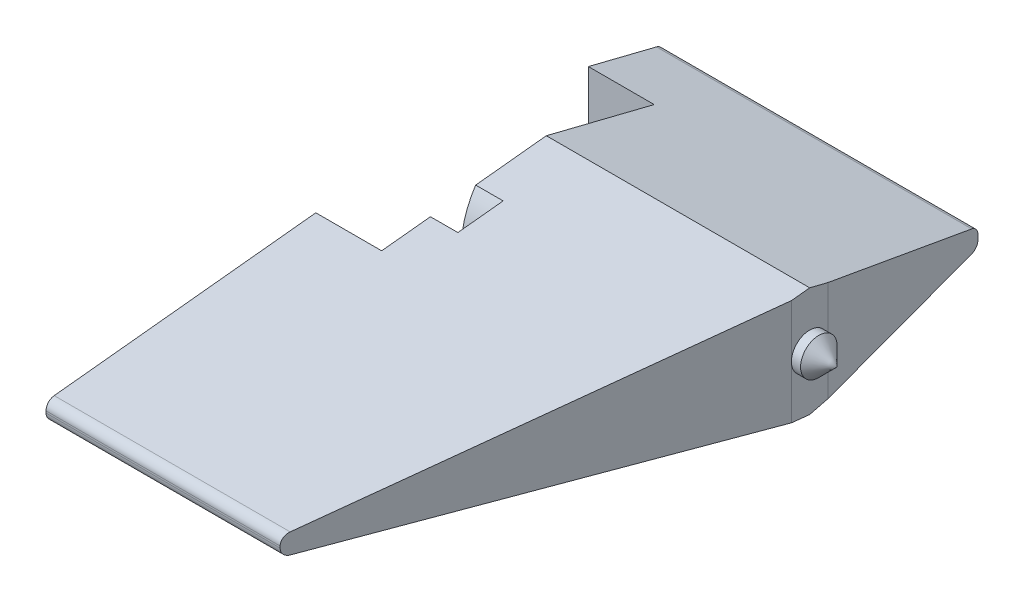
ISO-10303-21;
HEADER;
FILE_DESCRIPTION(('STEP AP214'),'2;1');
FILE_NAME('part.step','',(''),(''),'','','');
FILE_SCHEMA(('AUTOMOTIVE_DESIGN { 1 0 10303 214 1 1 1 1 }'));
ENDSEC;
DATA;
#1=APPLICATION_CONTEXT('core data for automotive mechanical design processes');
#2=APPLICATION_PROTOCOL_DEFINITION('international standard','automotive_design',2000,#1);
#3=PRODUCT_CONTEXT('',#1,'mechanical');
#4=PRODUCT('Part','Part','',(#3));
#5=PRODUCT_RELATED_PRODUCT_CATEGORY('part','',(#4));
#6=PRODUCT_DEFINITION_FORMATION('','',#4);
#7=PRODUCT_DEFINITION_CONTEXT('part definition',#1,'design');
#8=PRODUCT_DEFINITION('design','',#6,#7);
#9=PRODUCT_DEFINITION_SHAPE('','',#8);
#10=(LENGTH_UNIT() NAMED_UNIT(*) SI_UNIT(.MILLI.,.METRE.));
#11=(NAMED_UNIT(*) PLANE_ANGLE_UNIT() SI_UNIT($,.RADIAN.));
#12=(NAMED_UNIT(*) SI_UNIT($,.STERADIAN.) SOLID_ANGLE_UNIT());
#13=UNCERTAINTY_MEASURE_WITH_UNIT(LENGTH_MEASURE(1.E-05),#10,'distance_accuracy_value','');
#14=(GEOMETRIC_REPRESENTATION_CONTEXT(3) GLOBAL_UNCERTAINTY_ASSIGNED_CONTEXT((#13)) GLOBAL_UNIT_ASSIGNED_CONTEXT((#10,
#11,#12)) REPRESENTATION_CONTEXT('',''));
#15=CARTESIAN_POINT('',(0.,0.,0.));
#16=DIRECTION('',(0.,0.,1.));
#17=DIRECTION('',(1.,0.,0.));
#18=AXIS2_PLACEMENT_3D('',#15,#16,#17);
#19=CARTESIAN_POINT('',(18.,0.,0.));
#20=DIRECTION('',(-1.,0.,0.));
#21=DIRECTION('',(0.,0.,1.));
#22=AXIS2_PLACEMENT_3D('',#19,#20,#21);
#23=PLANE('',#22);
#24=DIRECTION('',(0.,0.104684784518043,-0.994505452921406));
#25=VECTOR('',#24,1.);
#26=CARTESIAN_POINT('',(18.,0.499999999999997,23.75));
#27=LINE('',#26,#25);
#28=CARTESIAN_POINT('',(18.,2.89473684210526,1.));
#29=VERTEX_POINT('',#28);
#30=CARTESIAN_POINT('',(18.,3.,0.));
#31=VERTEX_POINT('',#30);
#32=EDGE_CURVE('E348',#29,#31,#27,.T.);
#33=ORIENTED_EDGE('',*,*,#32,.F.);
#34=DIRECTION('',(0.,1.,0.));
#35=VECTOR('',#34,1.);
#36=CARTESIAN_POINT('',(18.,-3.0001,1.));
#37=LINE('',#36,#35);
#38=CARTESIAN_POINT('',(18.,0.,1.));
#39=VERTEX_POINT('',#38);
#40=EDGE_CURVE('E224',#39,#29,#37,.T.);
#41=ORIENTED_EDGE('',*,*,#40,.F.);
#42=CARTESIAN_POINT('',(18.,0.,0.));
#43=DIRECTION('',(-1.,0.,0.));
#44=DIRECTION('',(0.,0.,1.));
#45=AXIS2_PLACEMENT_3D('',#42,#43,#44);
#46=CIRCLE('',#45,1.);
#47=CARTESIAN_POINT('',(18.,0.,-1.));
#48=VERTEX_POINT('',#47);
#49=EDGE_CURVE('E444',#48,#39,#46,.F.);
#50=ORIENTED_EDGE('',*,*,#49,.F.);
#51=DIRECTION('',(0.,1.,0.));
#52=VECTOR('',#51,1.);
#53=CARTESIAN_POINT('',(18.,-3.0001,-1.));
#54=LINE('',#53,#52);
#55=CARTESIAN_POINT('',(18.,2.75,-1.));
#56=VERTEX_POINT('',#55);
#57=EDGE_CURVE('E506',#48,#56,#54,.T.);
#58=ORIENTED_EDGE('',*,*,#57,.T.);
#59=DIRECTION('',(0.,-0.242535625036333,-0.970142500145332));
#60=VECTOR('',#59,1.);
#61=CARTESIAN_POINT('',(18.,3.,0.));
#62=LINE('',#61,#60);
#63=EDGE_CURVE('E438',#31,#56,#62,.T.);
#64=ORIENTED_EDGE('',*,*,#63,.F.);
#65=EDGE_LOOP('',(#33,#41,#50,#58,#64));
#66=FACE_BOUND('',#65,.T.);
#67=ADVANCED_FACE('F48',(#66),#23,.F.);
#68=EDGE_CURVE('E222',#39,#48,#46,.F.);
#69=ORIENTED_EDGE('',*,*,#68,.F.);
#70=CARTESIAN_POINT('',(18.,-2.89473684210526,1.));
#71=VERTEX_POINT('',#70);
#72=EDGE_CURVE('E204',#71,#39,#37,.T.);
#73=ORIENTED_EDGE('',*,*,#72,.F.);
#74=DIRECTION('',(0.,-0.104684784518043,-0.994505452921406));
#75=VECTOR('',#74,1.);
#76=CARTESIAN_POINT('',(18.,-0.500000000000003,23.75));
#77=LINE('',#76,#75);
#78=CARTESIAN_POINT('',(18.,-3.,0.));
#79=VERTEX_POINT('',#78);
#80=EDGE_CURVE('E218',#71,#79,#77,.T.);
#81=ORIENTED_EDGE('',*,*,#80,.T.);
#82=DIRECTION('',(0.,0.242535625036333,-0.970142500145332));
#83=VECTOR('',#82,1.);
#84=CARTESIAN_POINT('',(18.,-3.,0.));
#85=LINE('',#84,#83);
#86=CARTESIAN_POINT('',(18.,-2.75,-1.));
#87=VERTEX_POINT('',#86);
#88=EDGE_CURVE('E232',#79,#87,#85,.T.);
#89=ORIENTED_EDGE('',*,*,#88,.T.);
#90=EDGE_CURVE('E501',#87,#48,#54,.T.);
#91=ORIENTED_EDGE('',*,*,#90,.T.);
#92=EDGE_LOOP('',(#69,#73,#81,#89,#91));
#93=FACE_BOUND('',#92,.T.);
#94=ADVANCED_FACE('F216',(#93),#23,.F.);
#95=CARTESIAN_POINT('',(0.,-2.96712328767123,0.312328767123287));
#96=DIRECTION('',(0.,0.994505452921406,-0.104684784518043));
#97=DIRECTION('',(0.,0.104684784518043,0.994505452921406));
#98=AXIS2_PLACEMENT_3D('',#95,#96,#97);
#99=PLANE('',#98);
#100=DIRECTION('',(-0.221660793310699,0.102080628498348,0.969765970734308));
#101=VECTOR('',#100,1.);
#102=CARTESIAN_POINT('',(17.2650559620951,-2.55627577201747,4.21538016583409));
#103=LINE('',#102,#101);
#104=CARTESIAN_POINT('',(12.9023217389122,-0.547121853446422,23.302342392259));
#105=VERTEX_POINT('',#104);
#106=EDGE_CURVE('E200',#71,#105,#103,.T.);
#107=ORIENTED_EDGE('',*,*,#106,.T.);
#108=DIRECTION('',(1.,0.,0.));
#109=VECTOR('',#108,1.);
#110=CARTESIAN_POINT('',(0.,-0.547121853446422,23.302342392259));
#111=LINE('',#110,#109);
#112=CARTESIAN_POINT('',(0.,-0.547121853446422,23.302342392259));
#113=VERTEX_POINT('',#112);
#114=EDGE_CURVE('E490',#105,#113,#111,.F.);
#115=ORIENTED_EDGE('',*,*,#114,.T.);
#116=DIRECTION('',(0.,-0.104684784518043,-0.994505452921406));
#117=VECTOR('',#116,1.);
#118=CARTESIAN_POINT('',(0.,-0.500000000000003,23.75));
#119=LINE('',#118,#117);
#120=CARTESIAN_POINT('',(0.,-2.05263157894737,9.));
#121=VERTEX_POINT('',#120);
#122=EDGE_CURVE('E285',#113,#121,#119,.T.);
#123=ORIENTED_EDGE('',*,*,#122,.T.);
#124=DIRECTION('',(1.,0.,0.));
#125=VECTOR('',#124,1.);
#126=CARTESIAN_POINT('',(0.,-2.05263157894737,9.));
#127=LINE('',#126,#125);
#128=CARTESIAN_POINT('',(3.6,-2.05263157894737,9.));
#129=VERTEX_POINT('',#128);
#130=EDGE_CURVE('E540',#121,#129,#127,.T.);
#131=ORIENTED_EDGE('',*,*,#130,.T.);
#132=DIRECTION('',(0.,-0.104684784518043,-0.994505452921406));
#133=VECTOR('',#132,1.);
#134=CARTESIAN_POINT('',(3.6,-2.96712328767123,0.312328767123287));
#135=LINE('',#134,#133);
#136=CARTESIAN_POINT('',(3.6,-2.33327329775217,6.3339036713544));
#137=VERTEX_POINT('',#136);
#138=EDGE_CURVE('E826',#129,#137,#135,.T.);
#139=ORIENTED_EDGE('',*,*,#138,.T.);
#140=DIRECTION('',(1.,0.,0.));
#141=VECTOR('',#140,1.);
#142=CARTESIAN_POINT('',(6.5,-2.33327329775217,6.3339036713544));
#143=LINE('',#142,#141);
#144=CARTESIAN_POINT('',(5.1,-2.33327329775217,6.3339036713544));
#145=VERTEX_POINT('',#144);
#146=EDGE_CURVE('E520',#145,#137,#143,.F.);
#147=ORIENTED_EDGE('',*,*,#146,.F.);
#148=DIRECTION('',(0.,0.104684784518043,0.994505452921406));
#149=VECTOR('',#148,1.);
#150=CARTESIAN_POINT('',(5.1,-2.96712328767123,0.312328767123287));
#151=LINE('',#150,#149);
#152=CARTESIAN_POINT('',(5.1,-2.59374727701062,3.85940086839914));
#153=VERTEX_POINT('',#152);
#154=EDGE_CURVE('E527',#153,#145,#151,.T.);
#155=ORIENTED_EDGE('',*,*,#154,.F.);
#156=DIRECTION('',(1.,0.,0.));
#157=VECTOR('',#156,1.);
#158=CARTESIAN_POINT('',(6.5,-2.59374727701062,3.85940086839914));
#159=LINE('',#158,#157);
#160=CARTESIAN_POINT('',(3.6,-2.59374727701062,3.85940086839914));
#161=VERTEX_POINT('',#160);
#162=EDGE_CURVE('E525',#161,#153,#159,.T.);
#163=ORIENTED_EDGE('',*,*,#162,.F.);
#164=CARTESIAN_POINT('',(3.6,-3.,0.));
#165=VERTEX_POINT('',#164);
#166=EDGE_CURVE('E825',#161,#165,#135,.T.);
#167=ORIENTED_EDGE('',*,*,#166,.T.);
#168=DIRECTION('',(1.,0.,0.));
#169=VECTOR('',#168,1.);
#170=CARTESIAN_POINT('',(0.,-3.,0.));
#171=LINE('',#170,#169);
#172=EDGE_CURVE('E229',#165,#79,#171,.T.);
#173=ORIENTED_EDGE('',*,*,#172,.T.);
#174=ORIENTED_EDGE('',*,*,#80,.F.);
#175=EDGE_LOOP('',(#107,#115,#123,#131,#139,#147,#155,#163,#167,#173,#174));
#176=FACE_BOUND('',#175,.T.);
#177=ADVANCED_FACE('F227',(#176),#99,.F.);
#178=CARTESIAN_POINT('',(0.,2.96712328767123,0.312328767123288));
#179=DIRECTION('',(0.,0.994505452921406,0.104684784518043));
#180=DIRECTION('',(0.,-0.104684784518043,0.994505452921406));
#181=AXIS2_PLACEMENT_3D('',#178,#179,#180);
#182=PLANE('',#181);
#183=DIRECTION('',(0.,0.104684784518043,-0.994505452921406));
#184=VECTOR('',#183,1.);
#185=CARTESIAN_POINT('',(0.,0.499999999999997,23.75));
#186=LINE('',#185,#184);
#187=CARTESIAN_POINT('',(0.,0.547121853446417,23.302342392259));
#188=VERTEX_POINT('',#187);
#189=CARTESIAN_POINT('',(0.,2.05263157894737,9.00000000000001));
#190=VERTEX_POINT('',#189);
#191=EDGE_CURVE('E346',#188,#190,#186,.T.);
#192=ORIENTED_EDGE('',*,*,#191,.F.);
#193=DIRECTION('',(1.,0.,0.));
#194=VECTOR('',#193,1.);
#195=CARTESIAN_POINT('',(0.,0.547121853446417,23.302342392259));
#196=LINE('',#195,#194);
#197=CARTESIAN_POINT('',(12.9023217389122,0.547121853446417,23.302342392259));
#198=VERTEX_POINT('',#197);
#199=EDGE_CURVE('E355',#188,#198,#196,.T.);
#200=ORIENTED_EDGE('',*,*,#199,.T.);
#201=DIRECTION('',(-0.221660793310699,-0.102080628498348,0.969765970734308));
#202=VECTOR('',#201,1.);
#203=CARTESIAN_POINT('',(17.2650559620951,2.55627577201746,4.21538016583409));
#204=LINE('',#203,#202);
#205=EDGE_CURVE('E212',#29,#198,#204,.T.);
#206=ORIENTED_EDGE('',*,*,#205,.F.);
#207=ORIENTED_EDGE('',*,*,#32,.T.);
#208=DIRECTION('',(1.,0.,0.));
#209=VECTOR('',#208,1.);
#210=CARTESIAN_POINT('',(0.,3.,0.));
#211=LINE('',#210,#209);
#212=CARTESIAN_POINT('',(3.6,3.,0.));
#213=VERTEX_POINT('',#212);
#214=EDGE_CURVE('E231',#213,#31,#211,.T.);
#215=ORIENTED_EDGE('',*,*,#214,.F.);
#216=DIRECTION('',(0.,0.104684784518043,-0.994505452921406));
#217=VECTOR('',#216,1.);
#218=CARTESIAN_POINT('',(3.6,2.96712328767123,0.312328767123288));
#219=LINE('',#218,#217);
#220=CARTESIAN_POINT('',(3.6,2.59374727701062,3.85940086839914));
#221=VERTEX_POINT('',#220);
#222=EDGE_CURVE('E823',#221,#213,#219,.T.);
#223=ORIENTED_EDGE('',*,*,#222,.F.);
#224=DIRECTION('',(1.,0.,0.));
#225=VECTOR('',#224,1.);
#226=CARTESIAN_POINT('',(6.5,2.59374727701062,3.85940086839914));
#227=LINE('',#226,#225);
#228=CARTESIAN_POINT('',(5.1,2.59374727701062,3.85940086839914));
#229=VERTEX_POINT('',#228);
#230=EDGE_CURVE('E522',#221,#229,#227,.T.);
#231=ORIENTED_EDGE('',*,*,#230,.T.);
#232=DIRECTION('',(0.,-0.104684784518043,0.994505452921406));
#233=VECTOR('',#232,1.);
#234=CARTESIAN_POINT('',(5.1,2.96712328767123,0.312328767123288));
#235=LINE('',#234,#233);
#236=CARTESIAN_POINT('',(5.1,2.33327329775217,6.3339036713544));
#237=VERTEX_POINT('',#236);
#238=EDGE_CURVE('E446',#229,#237,#235,.T.);
#239=ORIENTED_EDGE('',*,*,#238,.T.);
#240=DIRECTION('',(1.,0.,0.));
#241=VECTOR('',#240,1.);
#242=CARTESIAN_POINT('',(6.5,2.33327329775217,6.3339036713544));
#243=LINE('',#242,#241);
#244=CARTESIAN_POINT('',(3.6,2.33327329775217,6.3339036713544));
#245=VERTEX_POINT('',#244);
#246=EDGE_CURVE('E517',#237,#245,#243,.F.);
#247=ORIENTED_EDGE('',*,*,#246,.T.);
#248=CARTESIAN_POINT('',(3.6,2.05263157894737,9.));
#249=VERTEX_POINT('',#248);
#250=EDGE_CURVE('E821',#249,#245,#219,.T.);
#251=ORIENTED_EDGE('',*,*,#250,.F.);
#252=DIRECTION('',(1.,0.,0.));
#253=VECTOR('',#252,1.);
#254=CARTESIAN_POINT('',(0.,2.05263157894737,9.));
#255=LINE('',#254,#253);
#256=EDGE_CURVE('E776',#190,#249,#255,.T.);
#257=ORIENTED_EDGE('',*,*,#256,.F.);
#258=EDGE_LOOP('',(#192,#200,#206,#207,#215,#223,#231,#239,#247,#251,#257));
#259=FACE_BOUND('',#258,.T.);
#260=ADVANCED_FACE('F258',(#259),#182,.T.);
#261=CARTESIAN_POINT('',(3.6,-3.0001,-5.9));
#262=DIRECTION('',(1.,0.,0.));
#263=DIRECTION('',(0.,0.,-1.));
#264=AXIS2_PLACEMENT_3D('',#261,#262,#263);
#265=PLANE('',#264);
#266=CARTESIAN_POINT('',(3.6,0.,0.));
#267=DIRECTION('',(1.,0.,0.));
#268=DIRECTION('',(0.,0.,-1.));
#269=AXIS2_PLACEMENT_3D('',#266,#267,#268);
#270=CIRCLE('',#269,1.95);
#271=CARTESIAN_POINT('',(3.6,0.,1.95));
#272=VERTEX_POINT('',#271);
#273=EDGE_CURVE('E406',#272,#272,#270,.T.);
#274=ORIENTED_EDGE('',*,*,#273,.T.);
#275=EDGE_LOOP('',(#274));
#276=FACE_BOUND('',#275,.T.);
#277=CARTESIAN_POINT('',(3.6,0.,0.));
#278=DIRECTION('',(1.,0.,0.));
#279=DIRECTION('',(0.,0.,-1.));
#280=AXIS2_PLACEMENT_3D('',#277,#278,#279);
#281=CIRCLE('',#280,4.65);
#282=EDGE_CURVE('E449',#221,#161,#281,.T.);
#283=ORIENTED_EDGE('',*,*,#282,.F.);
#284=ORIENTED_EDGE('',*,*,#222,.T.);
#285=DIRECTION('',(0.,-0.242535625036333,-0.970142500145332));
#286=VECTOR('',#285,1.);
#287=CARTESIAN_POINT('',(3.6,2.82352941176471,-0.705882352941177));
#288=LINE('',#287,#286);
#289=CARTESIAN_POINT('',(3.6,1.525,-5.9));
#290=VERTEX_POINT('',#289);
#291=EDGE_CURVE('E802',#213,#290,#288,.T.);
#292=ORIENTED_EDGE('',*,*,#291,.T.);
#293=DIRECTION('',(0.,1.,0.));
#294=VECTOR('',#293,1.);
#295=CARTESIAN_POINT('',(3.6,-3.0001,-5.9));
#296=LINE('',#295,#294);
#297=CARTESIAN_POINT('',(3.6,-1.525,-5.9));
#298=VERTEX_POINT('',#297);
#299=EDGE_CURVE('E532',#298,#290,#296,.T.);
#300=ORIENTED_EDGE('',*,*,#299,.F.);
#301=DIRECTION('',(0.,0.242535625036333,-0.970142500145332));
#302=VECTOR('',#301,1.);
#303=CARTESIAN_POINT('',(3.6,-2.82352941176471,-0.705882352941178));
#304=LINE('',#303,#302);
#305=EDGE_CURVE('E543',#165,#298,#304,.T.);
#306=ORIENTED_EDGE('',*,*,#305,.F.);
#307=ORIENTED_EDGE('',*,*,#166,.F.);
#308=EDGE_LOOP('',(#283,#284,#292,#300,#306,#307));
#309=FACE_BOUND('',#308,.T.);
#310=ADVANCED_FACE('F370',(#276,#309),#265,.F.);
#311=CARTESIAN_POINT('',(3.6,0.,0.));
#312=DIRECTION('',(1.,0.,0.));
#313=DIRECTION('',(0.,0.,-1.));
#314=AXIS2_PLACEMENT_3D('',#311,#312,#313);
#315=CIRCLE('',#314,6.75);
#316=EDGE_CURVE('E451',#137,#245,#315,.F.);
#317=ORIENTED_EDGE('',*,*,#316,.F.);
#318=ORIENTED_EDGE('',*,*,#138,.F.);
#319=DIRECTION('',(0.,1.,0.));
#320=VECTOR('',#319,1.);
#321=CARTESIAN_POINT('',(3.6,-3.0001,9.));
#322=LINE('',#321,#320);
#323=EDGE_CURVE('E814',#129,#249,#322,.T.);
#324=ORIENTED_EDGE('',*,*,#323,.T.);
#325=ORIENTED_EDGE('',*,*,#250,.T.);
#326=EDGE_LOOP('',(#317,#318,#324,#325));
#327=FACE_BOUND('',#326,.T.);
#328=ADVANCED_FACE('F588',(#327),#265,.F.);
#329=CARTESIAN_POINT('',(0.,0.,0.));
#330=DIRECTION('',(-1.,0.,0.));
#331=DIRECTION('',(0.,0.,1.));
#332=AXIS2_PLACEMENT_3D('',#329,#330,#331);
#333=PLANE('',#332);
#334=DIRECTION('',(0.,-0.242535625036333,-0.970142500145332));
#335=VECTOR('',#334,1.);
#336=CARTESIAN_POINT('',(0.,3.,0.));
#337=LINE('',#336,#335);
#338=CARTESIAN_POINT('',(0.,1.525,-5.9));
#339=VERTEX_POINT('',#338);
#340=CARTESIAN_POINT('',(0.,0.594683046870458,-9.62126781251817));
#341=VERTEX_POINT('',#340);
#342=EDGE_CURVE('E773',#339,#341,#337,.T.);
#343=ORIENTED_EDGE('',*,*,#342,.T.);
#344=CARTESIAN_POINT('',(0.,0.109611796797793,-9.5));
#345=DIRECTION('',(-1.,0.,0.));
#346=DIRECTION('',(0.,0.,1.));
#347=AXIS2_PLACEMENT_3D('',#344,#345,#346);
#348=CIRCLE('',#347,0.5);
#349=CARTESIAN_POINT('',(0.,0.109611796797793,-10.));
#350=VERTEX_POINT('',#349);
#351=EDGE_CURVE('E58',#341,#350,#348,.T.);
#352=ORIENTED_EDGE('',*,*,#351,.T.);
#353=DIRECTION('',(0.,-1.,0.));
#354=VECTOR('',#353,1.);
#355=CARTESIAN_POINT('',(0.,0.5,-10.));
#356=LINE('',#355,#354);
#357=CARTESIAN_POINT('',(0.,-0.109611796797791,-10.));
#358=VERTEX_POINT('',#357);
#359=EDGE_CURVE('E484',#350,#358,#356,.T.);
#360=ORIENTED_EDGE('',*,*,#359,.T.);
#361=CARTESIAN_POINT('',(0.,-0.109611796797791,-9.5));
#362=DIRECTION('',(-1.,0.,0.));
#363=DIRECTION('',(0.,0.,1.));
#364=AXIS2_PLACEMENT_3D('',#361,#362,#363);
#365=CIRCLE('',#364,0.5);
#366=CARTESIAN_POINT('',(0.,-0.594683046870457,-9.62126781251817));
#367=VERTEX_POINT('',#366);
#368=EDGE_CURVE('E66',#358,#367,#365,.T.);
#369=ORIENTED_EDGE('',*,*,#368,.T.);
#370=DIRECTION('',(0.,0.242535625036333,-0.970142500145332));
#371=VECTOR('',#370,1.);
#372=CARTESIAN_POINT('',(0.,-3.,0.));
#373=LINE('',#372,#371);
#374=CARTESIAN_POINT('',(0.,-1.525,-5.9));
#375=VERTEX_POINT('',#374);
#376=EDGE_CURVE('E52',#375,#367,#373,.T.);
#377=ORIENTED_EDGE('',*,*,#376,.F.);
#378=DIRECTION('',(0.,1.,0.));
#379=VECTOR('',#378,1.);
#380=CARTESIAN_POINT('',(0.,-3.0001,-5.9));
#381=LINE('',#380,#379);
#382=EDGE_CURVE('E535',#375,#339,#381,.T.);
#383=ORIENTED_EDGE('',*,*,#382,.T.);
#384=EDGE_LOOP('',(#343,#352,#360,#369,#377,#383));
#385=FACE_BOUND('',#384,.T.);
#386=ADVANCED_FACE('F312',(#385),#333,.T.);
#387=DIRECTION('',(0.,1.,0.));
#388=VECTOR('',#387,1.);
#389=CARTESIAN_POINT('',(0.,-0.500000000000003,23.75));
#390=LINE('',#389,#388);
#391=CARTESIAN_POINT('',(0.,-0.0498691269857189,23.75));
#392=VERTEX_POINT('',#391);
#393=CARTESIAN_POINT('',(0.,0.0498691269857146,23.75));
#394=VERTEX_POINT('',#393);
#395=EDGE_CURVE('E774',#392,#394,#390,.T.);
#396=ORIENTED_EDGE('',*,*,#395,.T.);
#397=CARTESIAN_POINT('',(0.,0.0498691269857146,23.25));
#398=DIRECTION('',(-1.,0.,0.));
#399=DIRECTION('',(0.,0.,1.));
#400=AXIS2_PLACEMENT_3D('',#397,#398,#399);
#401=CIRCLE('',#400,0.5);
#402=EDGE_CURVE('E841',#394,#188,#401,.T.);
#403=ORIENTED_EDGE('',*,*,#402,.T.);
#404=ORIENTED_EDGE('',*,*,#191,.T.);
#405=DIRECTION('',(0.,1.,0.));
#406=VECTOR('',#405,1.);
#407=CARTESIAN_POINT('',(0.,-3.0001,9.));
#408=LINE('',#407,#406);
#409=EDGE_CURVE('E529',#121,#190,#408,.T.);
#410=ORIENTED_EDGE('',*,*,#409,.F.);
#411=ORIENTED_EDGE('',*,*,#122,.F.);
#412=CARTESIAN_POINT('',(0.,-0.049869126985719,23.25));
#413=DIRECTION('',(-1.,0.,0.));
#414=DIRECTION('',(0.,0.,1.));
#415=AXIS2_PLACEMENT_3D('',#412,#413,#414);
#416=CIRCLE('',#415,0.5);
#417=EDGE_CURVE('E294',#113,#392,#416,.T.);
#418=ORIENTED_EDGE('',*,*,#417,.T.);
#419=EDGE_LOOP('',(#396,#403,#404,#410,#411,#418));
#420=FACE_BOUND('',#419,.T.);
#421=ADVANCED_FACE('F303',(#420),#333,.T.);
#422=CARTESIAN_POINT('',(0.,-2.82352941176471,-0.705882352941177));
#423=DIRECTION('',(0.,0.970142500145332,0.242535625036333));
#424=DIRECTION('',(0.,-0.242535625036333,0.970142500145332));
#425=AXIS2_PLACEMENT_3D('',#422,#423,#424);
#426=PLANE('',#425);
#427=ORIENTED_EDGE('',*,*,#376,.T.);
#428=DIRECTION('',(1.,0.,0.));
#429=VECTOR('',#428,1.);
#430=CARTESIAN_POINT('',(17.2,-0.594683046870456,-9.62126781251817));
#431=LINE('',#430,#429);
#432=CARTESIAN_POINT('',(17.2336650833317,-0.594683046870456,-9.62126781251817));
#433=VERTEX_POINT('',#432);
#434=EDGE_CURVE('E12',#367,#433,#431,.T.);
#435=ORIENTED_EDGE('',*,*,#434,.T.);
#436=DIRECTION('',(0.0859160252342893,-0.241638820971439,0.966555283885756));
#437=VECTOR('',#436,1.);
#438=CARTESIAN_POINT('',(17.8930826677432,-2.44929500302759,-2.20281998788962));
#439=LINE('',#438,#437);
#440=EDGE_CURVE('E500',#433,#87,#439,.T.);
#441=ORIENTED_EDGE('',*,*,#440,.T.);
#442=ORIENTED_EDGE('',*,*,#88,.F.);
#443=ORIENTED_EDGE('',*,*,#172,.F.);
#444=ORIENTED_EDGE('',*,*,#305,.T.);
#445=DIRECTION('',(-1.,0.,0.));
#446=VECTOR('',#445,1.);
#447=CARTESIAN_POINT('',(0.,-1.525,-5.9));
#448=LINE('',#447,#446);
#449=EDGE_CURVE('E542',#298,#375,#448,.T.);
#450=ORIENTED_EDGE('',*,*,#449,.T.);
#451=EDGE_LOOP('',(#427,#435,#441,#442,#443,#444,#450));
#452=FACE_BOUND('',#451,.T.);
#453=ADVANCED_FACE('F259',(#452),#426,.F.);
#454=CARTESIAN_POINT('',(0.,0.,-10.));
#455=DIRECTION('',(0.,0.,-1.));
#456=DIRECTION('',(-1.,0.,0.));
#457=AXIS2_PLACEMENT_3D('',#454,#455,#456);
#458=PLANE('',#457);
#459=ORIENTED_EDGE('',*,*,#359,.F.);
#460=DIRECTION('',(1.,0.,0.));
#461=VECTOR('',#460,1.);
#462=CARTESIAN_POINT('',(0.,0.109611796797793,-10.));
#463=LINE('',#462,#461);
#464=CARTESIAN_POINT('',(17.2,0.109611796797793,-10.));
#465=VERTEX_POINT('',#464);
#466=EDGE_CURVE('E489',#350,#465,#463,.T.);
#467=ORIENTED_EDGE('',*,*,#466,.T.);
#468=DIRECTION('',(0.,1.,0.));
#469=VECTOR('',#468,1.);
#470=CARTESIAN_POINT('',(17.2,-3.0001,-10.));
#471=LINE('',#470,#469);
#472=CARTESIAN_POINT('',(17.2,-0.109611796797791,-10.));
#473=VERTEX_POINT('',#472);
#474=EDGE_CURVE('E211',#473,#465,#471,.T.);
#475=ORIENTED_EDGE('',*,*,#474,.F.);
#476=DIRECTION('',(1.,0.,0.));
#477=VECTOR('',#476,1.);
#478=CARTESIAN_POINT('',(0.,-0.109611796797791,-10.));
#479=LINE('',#478,#477);
#480=EDGE_CURVE('E487',#473,#358,#479,.F.);
#481=ORIENTED_EDGE('',*,*,#480,.T.);
#482=EDGE_LOOP('',(#459,#467,#475,#481));
#483=FACE_BOUND('',#482,.T.);
#484=ADVANCED_FACE('F262',(#483),#458,.T.);
#485=CARTESIAN_POINT('',(0.,2.82352941176471,-0.705882352941177));
#486=DIRECTION('',(0.,0.970142500145332,-0.242535625036333));
#487=DIRECTION('',(0.,0.242535625036333,0.970142500145332));
#488=AXIS2_PLACEMENT_3D('',#485,#486,#487);
#489=PLANE('',#488);
#490=DIRECTION('',(0.0859160252342893,0.241638820971439,0.966555283885756));
#491=VECTOR('',#490,1.);
#492=CARTESIAN_POINT('',(17.8930826677431,2.4492950030276,-2.20281998788962));
#493=LINE('',#492,#491);
#494=CARTESIAN_POINT('',(17.2336650833317,0.594683046870459,-9.62126781251817));
#495=VERTEX_POINT('',#494);
#496=EDGE_CURVE('E497',#495,#56,#493,.T.);
#497=ORIENTED_EDGE('',*,*,#496,.F.);
#498=DIRECTION('',(1.,0.,0.));
#499=VECTOR('',#498,1.);
#500=CARTESIAN_POINT('',(0.,0.594683046870459,-9.62126781251817));
#501=LINE('',#500,#499);
#502=EDGE_CURVE('E74',#495,#341,#501,.F.);
#503=ORIENTED_EDGE('',*,*,#502,.T.);
#504=ORIENTED_EDGE('',*,*,#342,.F.);
#505=DIRECTION('',(-1.,0.,0.));
#506=VECTOR('',#505,1.);
#507=CARTESIAN_POINT('',(0.,1.525,-5.9));
#508=LINE('',#507,#506);
#509=EDGE_CURVE('E453',#290,#339,#508,.T.);
#510=ORIENTED_EDGE('',*,*,#509,.F.);
#511=ORIENTED_EDGE('',*,*,#291,.F.);
#512=ORIENTED_EDGE('',*,*,#214,.T.);
#513=ORIENTED_EDGE('',*,*,#63,.T.);
#514=EDGE_LOOP('',(#497,#503,#504,#510,#511,#512,#513));
#515=FACE_BOUND('',#514,.T.);
#516=ADVANCED_FACE('F371',(#515),#489,.T.);
#517=CARTESIAN_POINT('',(0.,0.,23.75));
#518=DIRECTION('',(0.,0.,1.));
#519=DIRECTION('',(1.,0.,0.));
#520=AXIS2_PLACEMENT_3D('',#517,#518,#519);
#521=PLANE('',#520);
#522=DIRECTION('',(0.,1.,0.));
#523=VECTOR('',#522,1.);
#524=CARTESIAN_POINT('',(12.8,-3.0001,23.75));
#525=LINE('',#524,#523);
#526=CARTESIAN_POINT('',(12.8,-0.0498691269857189,23.75));
#527=VERTEX_POINT('',#526);
#528=CARTESIAN_POINT('',(12.8,0.0498691269857146,23.75));
#529=VERTEX_POINT('',#528);
#530=EDGE_CURVE('E868',#527,#529,#525,.T.);
#531=ORIENTED_EDGE('',*,*,#530,.T.);
#532=DIRECTION('',(1.,0.,0.));
#533=VECTOR('',#532,1.);
#534=CARTESIAN_POINT('',(0.,0.0498691269857146,23.75));
#535=LINE('',#534,#533);
#536=EDGE_CURVE('E847',#529,#394,#535,.F.);
#537=ORIENTED_EDGE('',*,*,#536,.T.);
#538=ORIENTED_EDGE('',*,*,#395,.F.);
#539=DIRECTION('',(1.,0.,0.));
#540=VECTOR('',#539,1.);
#541=CARTESIAN_POINT('',(12.8,-0.049869126985719,23.75));
#542=LINE('',#541,#540);
#543=EDGE_CURVE('E854',#392,#527,#542,.T.);
#544=ORIENTED_EDGE('',*,*,#543,.T.);
#545=EDGE_LOOP('',(#531,#537,#538,#544));
#546=FACE_BOUND('',#545,.T.);
#547=ADVANCED_FACE('F373',(#546),#521,.T.);
#548=CARTESIAN_POINT('',(0.,-3.0001,-5.9));
#549=DIRECTION('',(0.,0.,-1.));
#550=DIRECTION('',(-1.,0.,0.));
#551=AXIS2_PLACEMENT_3D('',#548,#549,#550);
#552=PLANE('',#551);
#553=ORIENTED_EDGE('',*,*,#299,.T.);
#554=ORIENTED_EDGE('',*,*,#509,.T.);
#555=ORIENTED_EDGE('',*,*,#382,.F.);
#556=ORIENTED_EDGE('',*,*,#449,.F.);
#557=EDGE_LOOP('',(#553,#554,#555,#556));
#558=FACE_BOUND('',#557,.T.);
#559=ADVANCED_FACE('F561',(#558),#552,.F.);
#560=CARTESIAN_POINT('',(0.,-3.0001,9.));
#561=DIRECTION('',(0.,0.,1.));
#562=DIRECTION('',(1.,0.,0.));
#563=AXIS2_PLACEMENT_3D('',#560,#561,#562);
#564=PLANE('',#563);
#565=ORIENTED_EDGE('',*,*,#409,.T.);
#566=ORIENTED_EDGE('',*,*,#256,.T.);
#567=ORIENTED_EDGE('',*,*,#323,.F.);
#568=ORIENTED_EDGE('',*,*,#130,.F.);
#569=EDGE_LOOP('',(#565,#566,#567,#568));
#570=FACE_BOUND('',#569,.T.);
#571=ADVANCED_FACE('F554',(#570),#564,.F.);
#572=CARTESIAN_POINT('',(6.5,0.,0.));
#573=DIRECTION('',(1.,0.,0.));
#574=DIRECTION('',(0.,0.,-1.));
#575=AXIS2_PLACEMENT_3D('',#572,#573,#574);
#576=PLANE('',#575);
#577=CARTESIAN_POINT('',(6.5,0.,0.));
#578=DIRECTION('',(1.,0.,0.));
#579=DIRECTION('',(0.,0.,-1.));
#580=AXIS2_PLACEMENT_3D('',#577,#578,#579);
#581=CIRCLE('',#580,1.95);
#582=CARTESIAN_POINT('',(6.5,0.,1.95));
#583=VERTEX_POINT('',#582);
#584=EDGE_CURVE('E271',#583,#583,#581,.T.);
#585=ORIENTED_EDGE('',*,*,#584,.F.);
#586=EDGE_LOOP('',(#585));
#587=FACE_BOUND('',#586,.T.);
#588=ADVANCED_FACE('F552',(#587),#576,.F.);
#589=CARTESIAN_POINT('',(6.5,0.,0.));
#590=DIRECTION('',(-1.,0.,0.));
#591=DIRECTION('',(0.,0.,1.));
#592=AXIS2_PLACEMENT_3D('',#589,#590,#591);
#593=CYLINDRICAL_SURFACE('',#592,1.95);
#594=CARTESIAN_POINT('',(3.6,0.,1.95));
#595=CARTESIAN_POINT('',(3.63020833333333,0.,1.95));
#596=CARTESIAN_POINT('',(3.66041666666667,0.,1.95));
#597=CARTESIAN_POINT('',(3.72083333333333,0.,1.95));
#598=CARTESIAN_POINT('',(3.75104166666667,0.,1.95));
#599=CARTESIAN_POINT('',(3.81145833333333,0.,1.95));
#600=CARTESIAN_POINT('',(3.84166666666667,0.,1.95));
#601=CARTESIAN_POINT('',(3.90208333333333,0.,1.95));
#602=CARTESIAN_POINT('',(3.93229166666667,0.,1.95));
#603=CARTESIAN_POINT('',(3.99270833333333,0.,1.95));
#604=CARTESIAN_POINT('',(4.02291666666667,0.,1.95));
#605=CARTESIAN_POINT('',(4.08333333333333,0.,1.95));
#606=CARTESIAN_POINT('',(4.11354166666667,0.,1.95));
#607=CARTESIAN_POINT('',(4.17395833333333,0.,1.95));
#608=CARTESIAN_POINT('',(4.20416666666667,0.,1.95));
#609=CARTESIAN_POINT('',(4.26458333333333,0.,1.95));
#610=CARTESIAN_POINT('',(4.29479166666667,0.,1.95));
#611=CARTESIAN_POINT('',(4.35520833333333,0.,1.95));
#612=CARTESIAN_POINT('',(4.38541666666667,0.,1.95));
#613=CARTESIAN_POINT('',(4.44583333333333,0.,1.95));
#614=CARTESIAN_POINT('',(4.47604166666667,0.,1.95));
#615=CARTESIAN_POINT('',(4.53645833333333,0.,1.95));
#616=CARTESIAN_POINT('',(4.56666666666667,0.,1.95));
#617=CARTESIAN_POINT('',(4.62708333333333,0.,1.95));
#618=CARTESIAN_POINT('',(4.65729166666667,0.,1.95));
#619=CARTESIAN_POINT('',(4.71770833333333,0.,1.95));
#620=CARTESIAN_POINT('',(4.74791666666667,0.,1.95));
#621=CARTESIAN_POINT('',(4.80833333333333,0.,1.95));
#622=CARTESIAN_POINT('',(4.83854166666667,0.,1.95));
#623=CARTESIAN_POINT('',(4.89895833333333,0.,1.95));
#624=CARTESIAN_POINT('',(4.92916666666667,0.,1.95));
#625=CARTESIAN_POINT('',(4.98958333333333,0.,1.95));
#626=CARTESIAN_POINT('',(5.01979166666667,0.,1.95));
#627=CARTESIAN_POINT('',(5.08020833333333,0.,1.95));
#628=CARTESIAN_POINT('',(5.11041666666667,0.,1.95));
#629=CARTESIAN_POINT('',(5.17083333333333,0.,1.95));
#630=CARTESIAN_POINT('',(5.20104166666667,0.,1.95));
#631=CARTESIAN_POINT('',(5.26145833333333,0.,1.95));
#632=CARTESIAN_POINT('',(5.29166666666667,0.,1.95));
#633=CARTESIAN_POINT('',(5.35208333333333,0.,1.95));
#634=CARTESIAN_POINT('',(5.38229166666667,0.,1.95));
#635=CARTESIAN_POINT('',(5.44270833333333,0.,1.95));
#636=CARTESIAN_POINT('',(5.47291666666667,0.,1.95));
#637=CARTESIAN_POINT('',(5.53333333333333,0.,1.95));
#638=CARTESIAN_POINT('',(5.56354166666667,0.,1.95));
#639=CARTESIAN_POINT('',(5.62395833333333,0.,1.95));
#640=CARTESIAN_POINT('',(5.65416666666667,0.,1.95));
#641=CARTESIAN_POINT('',(5.71458333333333,0.,1.95));
#642=CARTESIAN_POINT('',(5.74479166666667,0.,1.95));
#643=CARTESIAN_POINT('',(5.80520833333333,0.,1.95));
#644=CARTESIAN_POINT('',(5.83541666666667,0.,1.95));
#645=CARTESIAN_POINT('',(5.89583333333333,0.,1.95));
#646=CARTESIAN_POINT('',(5.92604166666667,0.,1.95));
#647=CARTESIAN_POINT('',(5.98645833333333,0.,1.95));
#648=CARTESIAN_POINT('',(6.01666666666667,0.,1.95));
#649=CARTESIAN_POINT('',(6.07708333333333,0.,1.95));
#650=CARTESIAN_POINT('',(6.10729166666667,0.,1.95));
#651=CARTESIAN_POINT('',(6.16770833333333,0.,1.95));
#652=CARTESIAN_POINT('',(6.19791666666667,0.,1.95));
#653=CARTESIAN_POINT('',(6.25833333333333,0.,1.95));
#654=CARTESIAN_POINT('',(6.28854166666667,0.,1.95));
#655=CARTESIAN_POINT('',(6.34895833333333,0.,1.95));
#656=CARTESIAN_POINT('',(6.37916666666667,0.,1.95));
#657=CARTESIAN_POINT('',(6.43958333333333,0.,1.95));
#658=CARTESIAN_POINT('',(6.46979166666667,0.,1.95));
#659=CARTESIAN_POINT('',(6.5,0.,1.95));
#660=B_SPLINE_CURVE_WITH_KNOTS('',3,(#594,#595,#596,#597,#598,#599,#600,#601,#602,#603,#604,
#605,#606,#607,#608,#609,#610,#611,#612,#613,#614,#615,#616,#617,#618,#619,#620,#621,#622,#623,
#624,#625,#626,#627,#628,#629,#630,#631,#632,#633,#634,#635,#636,#637,#638,#639,#640,#641,#642,
#643,#644,#645,#646,#647,#648,#649,#650,#651,#652,#653,#654,#655,#656,#657,#658,#659),
.UNSPECIFIED.,.F.,.F.,(4,2,2,2,2,2,2,2,2,2,2,2,2,2,2,2,2,2,2,2,2,2,2,2,2,2,2,2,2,2,2,2,4),(0.,
0.090625,0.18125,0.271875,0.3625,0.453125,0.54375,0.634374999999999,0.725,0.815625,0.90625,
0.996874999999999,1.0875,1.178125,1.26875,1.359375,1.45,1.540625,1.63125,1.721875,1.8125,
1.903125,1.99375,2.084375,2.175,2.265625,2.35625,2.446875,2.5375,2.628125,2.71875,2.809375,2.9),.UNSPECIFIED.);
#661=EDGE_CURVE('BSEAM313',#272,#583,#660,.T.);
#662=ORIENTED_EDGE('',*,*,#273,.F.);
#663=ORIENTED_EDGE('',*,*,#584,.T.);
#664=ORIENTED_EDGE('',*,*,#661,.T.);
#665=ORIENTED_EDGE('',*,*,#661,.F.);
#666=EDGE_LOOP('',(#662,#664,#663,#665));
#667=FACE_BOUND('',#666,.T.);
#668=ADVANCED_FACE('F313',(#667),#593,.F.);
#669=CARTESIAN_POINT('',(5.1,4.33881636538415,5.1707999910531));
#670=DIRECTION('',(-1.,0.,0.));
#671=DIRECTION('',(0.,0.,1.));
#672=AXIS2_PLACEMENT_3D('',#669,#670,#671);
#673=PLANE('',#672);
#674=ORIENTED_EDGE('',*,*,#154,.T.);
#675=CARTESIAN_POINT('',(5.1,0.,0.));
#676=DIRECTION('',(1.,0.,0.));
#677=DIRECTION('',(0.,0.,-1.));
#678=AXIS2_PLACEMENT_3D('',#675,#676,#677);
#679=CIRCLE('',#678,6.75);
#680=EDGE_CURVE('E511',#237,#145,#679,.T.);
#681=ORIENTED_EDGE('',*,*,#680,.F.);
#682=ORIENTED_EDGE('',*,*,#238,.F.);
#683=CARTESIAN_POINT('',(5.1,0.,0.));
#684=DIRECTION('',(1.,0.,0.));
#685=DIRECTION('',(0.,0.,-1.));
#686=AXIS2_PLACEMENT_3D('',#683,#684,#685);
#687=CIRCLE('',#686,4.65);
#688=EDGE_CURVE('E514',#229,#153,#687,.T.);
#689=ORIENTED_EDGE('',*,*,#688,.T.);
#690=EDGE_LOOP('',(#674,#681,#682,#689));
#691=FACE_BOUND('',#690,.T.);
#692=ADVANCED_FACE('F559',(#691),#673,.T.);
#693=CARTESIAN_POINT('',(6.5,0.,0.));
#694=DIRECTION('',(1.,0.,0.));
#695=DIRECTION('',(0.,0.,-1.));
#696=AXIS2_PLACEMENT_3D('',#693,#694,#695);
#697=CYLINDRICAL_SURFACE('',#696,4.65);
#698=ORIENTED_EDGE('',*,*,#162,.T.);
#699=ORIENTED_EDGE('',*,*,#688,.F.);
#700=ORIENTED_EDGE('',*,*,#230,.F.);
#701=ORIENTED_EDGE('',*,*,#282,.T.);
#702=EDGE_LOOP('',(#698,#699,#700,#701));
#703=FACE_BOUND('',#702,.T.);
#704=ADVANCED_FACE('F652',(#703),#697,.T.);
#705=CARTESIAN_POINT('',(6.5,0.,0.));
#706=DIRECTION('',(1.,0.,0.));
#707=DIRECTION('',(0.,0.,-1.));
#708=AXIS2_PLACEMENT_3D('',#705,#706,#707);
#709=CYLINDRICAL_SURFACE('',#708,6.75);
#710=ORIENTED_EDGE('',*,*,#146,.T.);
#711=ORIENTED_EDGE('',*,*,#316,.T.);
#712=ORIENTED_EDGE('',*,*,#246,.F.);
#713=ORIENTED_EDGE('',*,*,#680,.T.);
#714=EDGE_LOOP('',(#710,#711,#712,#713));
#715=FACE_BOUND('',#714,.T.);
#716=ADVANCED_FACE('F660',(#715),#709,.F.);
#717=CARTESIAN_POINT('',(19.5,0.,0.));
#718=DIRECTION('',(-1.,0.,0.));
#719=DIRECTION('',(0.,0.,1.));
#720=AXIS2_PLACEMENT_3D('',#717,#718,#719);
#721=CYLINDRICAL_SURFACE('',#720,1.);
#722=CARTESIAN_POINT('',(18.5,0.,0.));
#723=DIRECTION('',(1.,0.,0.));
#724=DIRECTION('',(0.,0.,-1.));
#725=AXIS2_PLACEMENT_3D('',#722,#723,#724);
#726=CIRCLE('',#725,1.);
#727=CARTESIAN_POINT('',(18.5,0.,-1.));
#728=VERTEX_POINT('',#727);
#729=EDGE_CURVE('E441',#728,#728,#726,.F.);
#730=ORIENTED_EDGE('',*,*,#729,.T.);
#731=EDGE_LOOP('',(#730));
#732=FACE_BOUND('',#731,.T.);
#733=ORIENTED_EDGE('',*,*,#49,.T.);
#734=ORIENTED_EDGE('',*,*,#68,.T.);
#735=EDGE_LOOP('',(#733,#734));
#736=FACE_BOUND('',#735,.T.);
#737=ADVANCED_FACE('F668',(#732,#736),#721,.T.);
#738=CARTESIAN_POINT('',(18.5,0.,0.));
#739=DIRECTION('',(-1.,0.,0.));
#740=DIRECTION('',(0.,0.,1.));
#741=AXIS2_PLACEMENT_3D('',#738,#739,#740);
#742=CONICAL_SURFACE('',#741,0.999999999999997,0.785398163397448);
#743=ORIENTED_EDGE('',*,*,#729,.F.);
#744=EDGE_LOOP('',(#743));
#745=FACE_BOUND('',#744,.T.);
#746=CARTESIAN_POINT('',(19.5,0.,0.));
#747=VERTEX_POINT('',#746);
#748=VERTEX_LOOP('',#747);
#749=FACE_BOUND('',#748,.T.);
#750=ADVANCED_FACE('F416',(#745,#749),#742,.T.);
#751=CARTESIAN_POINT('',(17.9470847623714,-3.0001,-1.5952964233219));
#752=DIRECTION('',(-0.996072640692686,0.,0.0885397902837942));
#753=DIRECTION('',(0.0885397902837942,0.,0.996072640692687));
#754=AXIS2_PLACEMENT_3D('',#751,#752,#753);
#755=PLANE('',#754);
#756=ORIENTED_EDGE('',*,*,#474,.T.);
#757=CARTESIAN_POINT('',(17.2444444444444,0.109611796797793,-9.5));
#758=DIRECTION('',(-0.996072640692686,0.,0.0885397902837942));
#759=DIRECTION('',(0.0885397902837942,0.,0.996072640692687));
#760=AXIS2_PLACEMENT_3D('',#757,#758,#759);
#761=ELLIPSE('',#760,0.501971422136734,0.5);
#762=EDGE_CURVE('E761',#465,#495,#761,.F.);
#763=ORIENTED_EDGE('',*,*,#762,.T.);
#764=ORIENTED_EDGE('',*,*,#496,.T.);
#765=ORIENTED_EDGE('',*,*,#57,.F.);
#766=ORIENTED_EDGE('',*,*,#90,.F.);
#767=ORIENTED_EDGE('',*,*,#440,.F.);
#768=CARTESIAN_POINT('',(17.2444444444444,-0.109611796797791,-9.5));
#769=DIRECTION('',(-0.996072640692686,0.,0.0885397902837942));
#770=DIRECTION('',(-0.0885397902837942,0.,-0.996072640692687));
#771=AXIS2_PLACEMENT_3D('',#768,#769,#770);
#772=ELLIPSE('',#771,0.501971422136734,0.5);
#773=EDGE_CURVE('E494',#433,#473,#772,.F.);
#774=ORIENTED_EDGE('',*,*,#773,.T.);
#775=EDGE_LOOP('',(#756,#763,#764,#765,#766,#767,#774));
#776=FACE_BOUND('',#775,.T.);
#777=ADVANCED_FACE('F681',(#776),#755,.F.);
#778=CARTESIAN_POINT('',(17.3235065942591,-3.0001,3.95965865011637));
#779=DIRECTION('',(-0.974858506571867,0.,-0.222824801502141));
#780=DIRECTION('',(-0.222824801502141,0.,0.974858506571867));
#781=AXIS2_PLACEMENT_3D('',#778,#779,#780);
#782=PLANE('',#781);
#783=ORIENTED_EDGE('',*,*,#205,.T.);
#784=CARTESIAN_POINT('',(12.9142857142857,0.0498691269857146,23.25));
#785=DIRECTION('',(-0.974858506571867,0.,-0.222824801502141));
#786=DIRECTION('',(0.222824801502141,0.,-0.974858506571867));
#787=AXIS2_PLACEMENT_3D('',#784,#785,#786);
#788=ELLIPSE('',#787,0.512894944886178,0.5);
#789=EDGE_CURVE('E856',#198,#529,#788,.F.);
#790=ORIENTED_EDGE('',*,*,#789,.T.);
#791=ORIENTED_EDGE('',*,*,#530,.F.);
#792=CARTESIAN_POINT('',(12.9142857142857,-0.049869126985719,23.25));
#793=DIRECTION('',(-0.974858506571867,0.,-0.222824801502141));
#794=DIRECTION('',(-0.222824801502141,0.,0.974858506571867));
#795=AXIS2_PLACEMENT_3D('',#792,#793,#794);
#796=ELLIPSE('',#795,0.512894944886178,0.5);
#797=EDGE_CURVE('E207',#527,#105,#796,.F.);
#798=ORIENTED_EDGE('',*,*,#797,.T.);
#799=ORIENTED_EDGE('',*,*,#106,.F.);
#800=ORIENTED_EDGE('',*,*,#72,.T.);
#801=ORIENTED_EDGE('',*,*,#40,.T.);
#802=EDGE_LOOP('',(#783,#790,#791,#798,#799,#800,#801));
#803=FACE_BOUND('',#802,.T.);
#804=ADVANCED_FACE('F203',(#803),#782,.F.);
#805=CARTESIAN_POINT('',(0.,0.0498691269857146,23.25));
#806=DIRECTION('',(1.,0.,0.));
#807=DIRECTION('',(0.,0.,-1.));
#808=AXIS2_PLACEMENT_3D('',#805,#806,#807);
#809=CYLINDRICAL_SURFACE('',#808,0.5);
#810=ORIENTED_EDGE('',*,*,#402,.F.);
#811=ORIENTED_EDGE('',*,*,#536,.F.);
#812=ORIENTED_EDGE('',*,*,#789,.F.);
#813=ORIENTED_EDGE('',*,*,#199,.F.);
#814=EDGE_LOOP('',(#810,#811,#812,#813));
#815=FACE_BOUND('',#814,.T.);
#816=ADVANCED_FACE('F694',(#815),#809,.T.);
#817=CARTESIAN_POINT('',(0.,-0.049869126985719,23.25));
#818=DIRECTION('',(-1.,0.,0.));
#819=DIRECTION('',(0.,0.,1.));
#820=AXIS2_PLACEMENT_3D('',#817,#818,#819);
#821=CYLINDRICAL_SURFACE('',#820,0.5);
#822=ORIENTED_EDGE('',*,*,#417,.F.);
#823=ORIENTED_EDGE('',*,*,#114,.F.);
#824=ORIENTED_EDGE('',*,*,#797,.F.);
#825=ORIENTED_EDGE('',*,*,#543,.F.);
#826=EDGE_LOOP('',(#822,#823,#824,#825));
#827=FACE_BOUND('',#826,.T.);
#828=ADVANCED_FACE('F701',(#827),#821,.T.);
#829=CARTESIAN_POINT('',(0.,0.109611796797793,-9.5));
#830=DIRECTION('',(1.,0.,0.));
#831=DIRECTION('',(0.,0.,-1.));
#832=AXIS2_PLACEMENT_3D('',#829,#830,#831);
#833=CYLINDRICAL_SURFACE('',#832,0.5);
#834=ORIENTED_EDGE('',*,*,#351,.F.);
#835=ORIENTED_EDGE('',*,*,#502,.F.);
#836=ORIENTED_EDGE('',*,*,#762,.F.);
#837=ORIENTED_EDGE('',*,*,#466,.F.);
#838=EDGE_LOOP('',(#834,#835,#836,#837));
#839=FACE_BOUND('',#838,.T.);
#840=ADVANCED_FACE('F708',(#839),#833,.T.);
#841=CARTESIAN_POINT('',(0.,-0.109611796797791,-9.5));
#842=DIRECTION('',(-1.,0.,0.));
#843=DIRECTION('',(0.,0.,1.));
#844=AXIS2_PLACEMENT_3D('',#841,#842,#843);
#845=CYLINDRICAL_SURFACE('',#844,0.5);
#846=ORIENTED_EDGE('',*,*,#368,.F.);
#847=ORIENTED_EDGE('',*,*,#480,.F.);
#848=ORIENTED_EDGE('',*,*,#773,.F.);
#849=ORIENTED_EDGE('',*,*,#434,.F.);
#850=EDGE_LOOP('',(#846,#847,#848,#849));
#851=FACE_BOUND('',#850,.T.);
#852=ADVANCED_FACE('F50',(#851),#845,.T.);
#853=CLOSED_SHELL('',(#67,#94,#177,#260,#310,#328,#386,#421,#453,#484,#516,#547,#559,#571,#588,
#668,#692,#704,#716,#737,#750,#777,#804,#816,#828,#840,#852));
#854=MANIFOLD_SOLID_BREP('B2',#853);
#855=ADVANCED_BREP_SHAPE_REPRESENTATION('',(#18,#854),#14);
#856=SHAPE_DEFINITION_REPRESENTATION(#9,#855);
ENDSEC;
END-ISO-10303-21;
